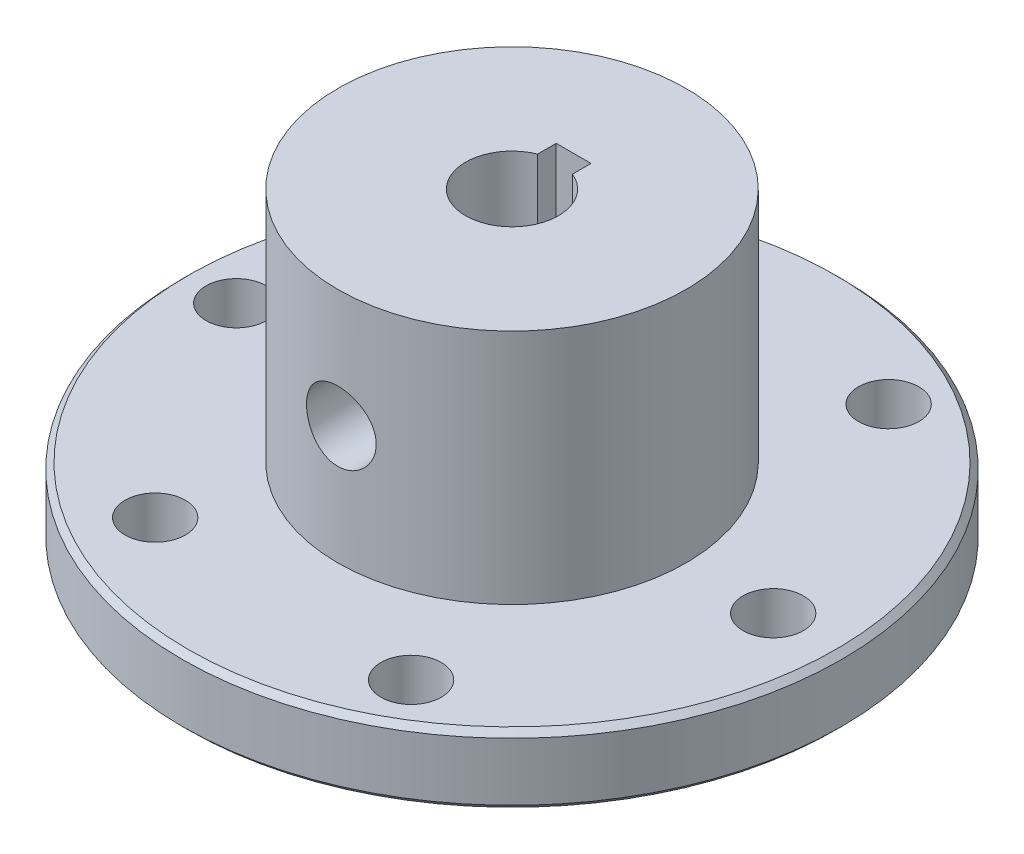
ISO-10303-21;
HEADER;
FILE_DESCRIPTION(('STEP AP214'),'2;1');
FILE_NAME('part.step','',(''),(''),'','','');
FILE_SCHEMA(('AUTOMOTIVE_DESIGN { 1 0 10303 214 1 1 1 1 }'));
ENDSEC;
DATA;
#1=APPLICATION_CONTEXT('core data for automotive mechanical design processes');
#2=APPLICATION_PROTOCOL_DEFINITION('international standard','automotive_design',2000,#1);
#3=PRODUCT_CONTEXT('',#1,'mechanical');
#4=PRODUCT('Part','Part','',(#3));
#5=PRODUCT_RELATED_PRODUCT_CATEGORY('part','',(#4));
#6=PRODUCT_DEFINITION_FORMATION('','',#4);
#7=PRODUCT_DEFINITION_CONTEXT('part definition',#1,'design');
#8=PRODUCT_DEFINITION('design','',#6,#7);
#9=PRODUCT_DEFINITION_SHAPE('','',#8);
#10=(LENGTH_UNIT() NAMED_UNIT(*) SI_UNIT(.MILLI.,.METRE.));
#11=(NAMED_UNIT(*) PLANE_ANGLE_UNIT() SI_UNIT($,.RADIAN.));
#12=(NAMED_UNIT(*) SI_UNIT($,.STERADIAN.) SOLID_ANGLE_UNIT());
#13=UNCERTAINTY_MEASURE_WITH_UNIT(LENGTH_MEASURE(1.E-05),#10,'distance_accuracy_value','');
#14=(GEOMETRIC_REPRESENTATION_CONTEXT(3) GLOBAL_UNCERTAINTY_ASSIGNED_CONTEXT((#13)) GLOBAL_UNIT_ASSIGNED_CONTEXT((#10,
#11,#12)) REPRESENTATION_CONTEXT('',''));
#15=CARTESIAN_POINT('',(0.,0.,0.));
#16=DIRECTION('',(0.,0.,1.));
#17=DIRECTION('',(1.,0.,0.));
#18=AXIS2_PLACEMENT_3D('',#15,#16,#17);
#19=CARTESIAN_POINT('',(0.,37.7137084989848,0.));
#20=DIRECTION('',(0.,-1.,0.));
#21=DIRECTION('',(0.,0.,-1.));
#22=AXIS2_PLACEMENT_3D('',#19,#20,#21);
#23=CYLINDRICAL_SURFACE('',#22,4.);
#24=CARTESIAN_POINT('',(0.,0.,0.));
#25=DIRECTION('',(0.,1.,0.));
#26=DIRECTION('',(0.,0.,1.));
#27=AXIS2_PLACEMENT_3D('',#24,#25,#26);
#28=CIRCLE('',#27,4.);
#29=CARTESIAN_POINT('',(-1.49999999999657,0.,-3.70809924354644));
#30=VERTEX_POINT('',#29);
#31=CARTESIAN_POINT('',(1.50000000000343,0.,-3.70809924354644));
#32=VERTEX_POINT('',#31);
#33=EDGE_CURVE('E157',#30,#32,#28,.T.);
#34=ORIENTED_EDGE('',*,*,#33,.F.);
#35=DIRECTION('',(0.,1.,0.));
#36=VECTOR('',#35,1.);
#37=CARTESIAN_POINT('',(-1.49999999999657,-3.4,-3.70809924354644));
#38=LINE('',#37,#36);
#39=CARTESIAN_POINT('',(-1.49999999999657,26.4,-3.70809924354644));
#40=VERTEX_POINT('',#39);
#41=EDGE_CURVE('E116',#30,#40,#38,.T.);
#42=ORIENTED_EDGE('',*,*,#41,.T.);
#43=CARTESIAN_POINT('',(0.,26.4,0.));
#44=DIRECTION('',(0.,1.,0.));
#45=DIRECTION('',(0.,0.,1.));
#46=AXIS2_PLACEMENT_3D('',#43,#44,#45);
#47=CIRCLE('',#46,4.);
#48=CARTESIAN_POINT('',(1.50000000000343,26.4,-3.70809924354644));
#49=VERTEX_POINT('',#48);
#50=EDGE_CURVE('E160',#40,#49,#47,.T.);
#51=ORIENTED_EDGE('',*,*,#50,.T.);
#52=DIRECTION('',(0.,1.,0.));
#53=VECTOR('',#52,1.);
#54=CARTESIAN_POINT('',(1.50000000000343,-3.4,-3.70809924354644));
#55=LINE('',#54,#53);
#56=EDGE_CURVE('E93',#32,#49,#55,.T.);
#57=ORIENTED_EDGE('',*,*,#56,.F.);
#58=EDGE_LOOP('',(#34,#42,#51,#57));
#59=FACE_BOUND('',#58,.T.);
#60=CARTESIAN_POINT('',(-3.,16.2,2.64575131106459));
#61=CARTESIAN_POINT('',(-3.00000280896557,16.1299599890454,2.645745510217));
#62=CARTESIAN_POINT('',(-2.99754094962657,16.0599423684369,2.64854755685349));
#63=CARTESIAN_POINT('',(-2.98778335234161,15.9206616329603,2.65954937326353));
#64=CARTESIAN_POINT('',(-2.98048600162194,15.8513987776647,2.6677509439258));
#65=CARTESIAN_POINT('',(-2.95155901854998,15.6454873787393,2.69984445943127));
#66=CARTESIAN_POINT('',(-2.92289529116371,15.5109260545199,2.73122303815329));
#67=CARTESIAN_POINT('',(-2.84967902852603,15.2528018992776,2.80749414131084));
#68=CARTESIAN_POINT('',(-2.80535116546462,15.1291129376528,2.85219424245675));
#69=CARTESIAN_POINT('',(-2.70261160960258,14.8913185987831,2.94973182273596));
#70=CARTESIAN_POINT('',(-2.64420161900243,14.7772120654922,3.0025683180905));
#71=CARTESIAN_POINT('',(-2.50080271595863,14.5357748543409,3.12354326851478));
#72=CARTESIAN_POINT('',(-2.41280926238807,14.4106800141176,3.19256884637289));
#73=CARTESIAN_POINT('',(-2.2186541254275,14.1749331613865,3.33043252944682));
#74=CARTESIAN_POINT('',(-2.11246568694302,14.0643028469581,3.3992702047211));
#75=CARTESIAN_POINT('',(-1.92836490190185,13.8999968907141,3.50539769561967));
#76=CARTESIAN_POINT('',(-1.85597029075026,13.8411504858405,3.54435965000119));
#77=CARTESIAN_POINT('',(-1.70504181430758,13.7298545058005,3.6193818859952));
#78=CARTESIAN_POINT('',(-1.62651080993559,13.6774019785274,3.6554435040806));
#79=CARTESIAN_POINT('',(-1.4637040910827,13.5795860727125,3.72361957309374));
#80=CARTESIAN_POINT('',(-1.37943756818547,13.5342117179806,3.75574011862965));
#81=CARTESIAN_POINT('',(-1.20559494807533,13.4512147175475,3.81509912700353));
#82=CARTESIAN_POINT('',(-1.11602169211668,13.4135879711787,3.84234017147395));
#83=CARTESIAN_POINT('',(-0.895799479373831,13.333620890258,3.90065407398259));
#84=CARTESIAN_POINT('',(-0.762908554560555,13.2952955212933,3.92898588633407));
#85=CARTESIAN_POINT('',(-0.491088777779701,13.2372100632104,3.97212104358515));
#86=CARTESIAN_POINT('',(-0.352165281713016,13.2174338444641,3.98693614179333));
#87=CARTESIAN_POINT('',(-0.0717346069513471,13.1975591423444,4.00182527262811));
#88=CARTESIAN_POINT('',(0.0697783346711295,13.197511789889,4.00186100185061));
#89=CARTESIAN_POINT('',(0.350633497188302,13.2172351747569,3.9870847294994));
#90=CARTESIAN_POINT('',(0.48997520779821,13.2370105015565,3.97226928948599));
#91=CARTESIAN_POINT('',(0.757778086122689,13.2941622791287,3.92982740624245));
#92=CARTESIAN_POINT('',(0.886448455408851,13.3309127006248,3.90265711426681));
#93=CARTESIAN_POINT('',(1.13536105117421,13.4199912365033,3.83764561419608));
#94=CARTESIAN_POINT('',(1.25560143283417,13.4723227475875,3.79980207941239));
#95=CARTESIAN_POINT('',(1.49843381849742,13.5970592451846,3.7112209069133));
#96=CARTESIAN_POINT('',(1.61987076262547,13.6710241972518,3.65953080871578));
#97=CARTESIAN_POINT('',(1.84913450790411,13.8334674039233,3.54921405312389));
#98=CARTESIAN_POINT('',(1.95694957120902,13.9219580262415,3.49058149661275));
#99=CARTESIAN_POINT('',(2.17816408331312,14.130446699028,3.35787531624607));
#100=CARTESIAN_POINT('',(2.28848985950527,14.2532184203887,3.28303311698989));
#101=CARTESIAN_POINT('',(2.48801751171524,14.5156691669079,3.13451916601303));
#102=CARTESIAN_POINT('',(2.57720932423716,14.6553561990931,3.06084798741906));
#103=CARTESIAN_POINT('',(2.71746412822589,14.9219637404567,2.93638851986388));
#104=CARTESIAN_POINT('',(2.77257733772077,15.0459740902602,2.88395199558713));
#105=CARTESIAN_POINT('',(2.86638794181777,15.3041305631791,2.79073482535992));
#106=CARTESIAN_POINT('',(2.90512243472909,15.4382529607061,2.74992790713867));
#107=CARTESIAN_POINT('',(2.95804770816485,15.687373886934,2.69280101182057));
#108=CARTESIAN_POINT('',(2.97558139385094,15.800894160623,2.67323078916896));
#109=CARTESIAN_POINT('',(2.9974352084815,16.0307109359537,2.6487117707326));
#110=CARTESIAN_POINT('',(3.00177224296671,16.1470036931607,2.64374426844221));
#111=CARTESIAN_POINT('',(2.99690541681498,16.3789579701068,2.64925736853119));
#112=CARTESIAN_POINT('',(2.98769657209908,16.4946192417781,2.6597436569903));
#113=CARTESIAN_POINT('',(2.95645049123765,16.7221523548121,2.6944244027003));
#114=CARTESIAN_POINT('',(2.93439135868922,16.8340173823666,2.71864225613374));
#115=CARTESIAN_POINT('',(2.86827946945848,17.0926758336122,2.78855502614561));
#116=CARTESIAN_POINT('',(2.81908501412404,17.2368707852246,2.83889586236445));
#117=CARTESIAN_POINT('',(2.70177633577471,17.5126164519626,2.95075783431284));
#118=CARTESIAN_POINT('',(2.6336272774567,17.6441432802658,3.01229948253766));
#119=CARTESIAN_POINT('',(2.47740025533047,17.8986936195923,3.14216325235084));
#120=CARTESIAN_POINT('',(2.38870032302785,18.0212490600596,3.21064858311595));
#121=CARTESIAN_POINT('',(2.19363312764519,18.2520208932289,3.34695922368101));
#122=CARTESIAN_POINT('',(2.08725728128944,18.360230273483,3.41478419579482));
#123=CARTESIAN_POINT('',(1.90239818691816,18.5215321316569,3.51957077757727));
#124=CARTESIAN_POINT('',(1.82922305126,18.5796581195259,3.55825033527664));
#125=CARTESIAN_POINT('',(1.67675777822379,18.6894381443225,3.63258399954073));
#126=CARTESIAN_POINT('',(1.59747053828962,18.7410952177284,3.66823952301724));
#127=CARTESIAN_POINT('',(1.43317795543372,18.8372413626488,3.73548722322447));
#128=CARTESIAN_POINT('',(1.34818053963823,18.8817400916681,3.7670848627361));
#129=CARTESIAN_POINT('',(1.1729453282209,18.962883343752,3.82527474095149));
#130=CARTESIAN_POINT('',(1.08271039442742,18.9995321057078,3.85186968010571));
#131=CARTESIAN_POINT('',(0.861573588365216,19.0768394641138,3.90835673615322));
#132=CARTESIAN_POINT('',(0.728516792900315,19.1135038047252,3.93550115203699));
#133=CARTESIAN_POINT('',(0.456712266621236,19.1682673656796,3.97621371280714));
#134=CARTESIAN_POINT('',(0.317969739628331,19.1863831844557,3.98979399550191));
#135=CARTESIAN_POINT('',(0.0382996918456589,19.2030301543583,4.0022690757003));
#136=CARTESIAN_POINT('',(-0.102632185789808,19.2015153312943,4.00112939966075));
#137=CARTESIAN_POINT('',(-0.382019221764016,19.1788787209871,3.9841766697547));
#138=CARTESIAN_POINT('',(-0.520473710285121,19.1577517104191,3.96835970687872));
#139=CARTESIAN_POINT('',(-0.787043562612911,19.0980499872263,3.92406786315679));
#140=CARTESIAN_POINT('',(-0.915342390371097,19.0599995894081,3.89597377375742));
#141=CARTESIAN_POINT('',(-1.16332276886422,18.9684239167212,3.82925445361189));
#142=CARTESIAN_POINT('',(-1.28300246946202,18.9148953316785,3.7906269702888));
#143=CARTESIAN_POINT('',(-1.52509537227953,18.7874441121832,3.70035282969446));
#144=CARTESIAN_POINT('',(-1.64628246914876,18.711898143361,3.64772704497865));
#145=CARTESIAN_POINT('',(-1.87482962773042,18.5462671128058,3.53571013069579));
#146=CARTESIAN_POINT('',(-1.98217681660194,18.4561686884255,3.47631279811073));
#147=CARTESIAN_POINT('',(-2.20224762299358,18.2439893112008,3.34212703425337));
#148=CARTESIAN_POINT('',(-2.31183387997297,18.1191073872141,3.26661834639248));
#149=CARTESIAN_POINT('',(-2.50950501943595,17.8522636700383,3.11732175300605));
#150=CARTESIAN_POINT('',(-2.59758202428157,17.7102956474977,3.04353448686308));
#151=CARTESIAN_POINT('',(-2.73391957253569,17.4422340480079,2.9209917244315));
#152=CARTESIAN_POINT('',(-2.78667101930055,17.3193318797256,2.87027147723429));
#153=CARTESIAN_POINT('',(-2.87610746935093,17.0638323336928,2.78065231320265));
#154=CARTESIAN_POINT('',(-2.91283513703737,16.931261812137,2.74172209031511));
#155=CARTESIAN_POINT('',(-2.95994243938014,16.6984283715323,2.69064580071015));
#156=CARTESIAN_POINT('',(-2.97488911938737,16.6000813613047,2.67399401036028));
#157=CARTESIAN_POINT('',(-2.99491264524007,16.4011398406143,2.65155449367015));
#158=CARTESIAN_POINT('',(-2.99999596755293,16.3005468488339,2.6457596385468));
#159=CARTESIAN_POINT('',(-3.,16.2,2.64575131106459));
#160=B_SPLINE_CURVE_WITH_KNOTS('',3,(#60,#61,#62,#63,#64,#65,#66,#67,#68,#69,#70,#71,#72,#73,
#74,#75,#76,#77,#78,#79,#80,#81,#82,#83,#84,#85,#86,#87,#88,#89,#90,#91,#92,#93,#94,#95,#96,#97,
#98,#99,#100,#101,#102,#103,#104,#105,#106,#107,#108,#109,#110,#111,#112,#113,#114,#115,#116,
#117,#118,#119,#120,#121,#122,#123,#124,#125,#126,#127,#128,#129,#130,#131,#132,#133,#134,#135,
#136,#137,#138,#139,#140,#141,#142,#143,#144,#145,#146,#147,#148,#149,#150,#151,#152,#153,#154,
#155,#156,#157,#158,#159),.UNSPECIFIED.,.T.,.F.,(4,2,2,2,2,2,2,2,2,2,2,2,2,2,2,2,2,2,2,2,2,2,2,
2,2,2,2,2,2,2,2,2,2,2,2,2,2,2,2,2,2,2,2,2,2,2,2,2,2,4),(0.,0.209978661686241,0.420027392494301,
0.840743284291307,1.2556546103656,1.67051580847,2.17226801294869,2.6747644597623,
2.97770625271005,3.2805076408197,3.58283470135666,3.88500133203434,4.30659768868618,
4.7278271005493,5.15014819769121,5.57256709596084,5.98051830103608,6.38855850530846,
6.84078006547297,7.29338868088834,7.83503352722911,8.37693577609373,8.81203137267901,
9.24613611539519,9.5942032940531,9.94182439389893,10.2895734296593,10.6379167570555,
11.116643747183,11.5962564359181,12.0929073649363,12.5898001720674,12.8928465253493,
13.1957500925973,13.4982415141315,13.8005691796993,14.2206053318566,14.6402652787516,
15.0609082299889,15.4816632434469,15.8902036618063,16.2988315155547,16.7537484577602,
17.2090855228609,17.7544990195311,18.3001119721386,18.7279130007847,19.154567923422,
19.4562036495329,19.7576412488016),.UNSPECIFIED.);
#161=CARTESIAN_POINT('',(-3.,16.2,2.64575131106459));
#162=VERTEX_POINT('',#161);
#163=EDGE_CURVE('E108',#162,#162,#160,.T.);
#164=ORIENTED_EDGE('',*,*,#163,.T.);
#165=EDGE_LOOP('',(#164));
#166=FACE_BOUND('',#165,.T.);
#167=ADVANCED_FACE('F43',(#59,#166),#23,.F.);
#168=CARTESIAN_POINT('',(0.,26.4,0.));
#169=DIRECTION('',(0.,1.,0.));
#170=DIRECTION('',(0.,0.,1.));
#171=AXIS2_PLACEMENT_3D('',#168,#169,#170);
#172=PLANE('',#171);
#173=ORIENTED_EDGE('',*,*,#50,.F.);
#174=DIRECTION('',(0.,0.,-1.));
#175=VECTOR('',#174,1.);
#176=CARTESIAN_POINT('',(-1.49999999999657,26.4,0.));
#177=LINE('',#176,#175);
#178=CARTESIAN_POINT('',(-1.49999999999657,26.4,-5.30809924354644));
#179=VERTEX_POINT('',#178);
#180=EDGE_CURVE('E101',#40,#179,#177,.T.);
#181=ORIENTED_EDGE('',*,*,#180,.T.);
#182=DIRECTION('',(1.,0.,0.));
#183=VECTOR('',#182,1.);
#184=CARTESIAN_POINT('',(0.,26.4,-5.30809924354644));
#185=LINE('',#184,#183);
#186=CARTESIAN_POINT('',(1.50000000000343,26.4,-5.30809924354644));
#187=VERTEX_POINT('',#186);
#188=EDGE_CURVE('E89',#179,#187,#185,.T.);
#189=ORIENTED_EDGE('',*,*,#188,.T.);
#190=DIRECTION('',(0.,0.,1.));
#191=VECTOR('',#190,1.);
#192=CARTESIAN_POINT('',(1.50000000000343,26.4,0.));
#193=LINE('',#192,#191);
#194=EDGE_CURVE('E96',#187,#49,#193,.T.);
#195=ORIENTED_EDGE('',*,*,#194,.T.);
#196=EDGE_LOOP('',(#173,#181,#189,#195));
#197=FACE_BOUND('',#196,.T.);
#198=CARTESIAN_POINT('',(0.,26.4,0.));
#199=DIRECTION('',(0.,1.,0.));
#200=DIRECTION('',(0.,0.,1.));
#201=AXIS2_PLACEMENT_3D('',#198,#199,#200);
#202=CIRCLE('',#201,15.);
#203=CARTESIAN_POINT('',(0.,26.4,15.));
#204=VERTEX_POINT('',#203);
#205=EDGE_CURVE('E162',#204,#204,#202,.T.);
#206=ORIENTED_EDGE('',*,*,#205,.T.);
#207=EDGE_LOOP('',(#206));
#208=FACE_BOUND('',#207,.T.);
#209=ADVANCED_FACE('F103',(#197,#208),#172,.T.);
#210=CARTESIAN_POINT('',(0.,26.4,0.));
#211=DIRECTION('',(0.,-1.,0.));
#212=DIRECTION('',(0.,0.,-1.));
#213=AXIS2_PLACEMENT_3D('',#210,#211,#212);
#214=CYLINDRICAL_SURFACE('',#213,15.);
#215=CARTESIAN_POINT('',(-3.,16.2,14.6969384566991));
#216=CARTESIAN_POINT('',(-2.99999198480185,16.3665193361401,14.6969426132629));
#217=CARTESIAN_POINT('',(-2.98607569250481,16.5332456360587,14.6998020102084));
#218=CARTESIAN_POINT('',(-2.93078641718596,16.8621151386166,14.7109229493115));
#219=CARTESIAN_POINT('',(-2.88935895976318,17.0242485815656,14.7191952089108));
#220=CARTESIAN_POINT('',(-2.78037980337341,17.3389280436671,14.7401676901752));
#221=CARTESIAN_POINT('',(-2.71286603599808,17.49148761131,14.7528614799519));
#222=CARTESIAN_POINT('',(-2.55372247754635,17.7830637317369,14.781238226133));
#223=CARTESIAN_POINT('',(-2.46210056979045,17.9220846912995,14.7969202049432));
#224=CARTESIAN_POINT('',(-2.25593999242807,18.184679081421,14.8297585534668));
#225=CARTESIAN_POINT('',(-2.14112308660168,18.3080320867916,14.8469312215107));
#226=CARTESIAN_POINT('',(-1.89242749025971,18.5338672529959,14.880673286009));
#227=CARTESIAN_POINT('',(-1.75854645433866,18.6363468420571,14.8972426079201));
#228=CARTESIAN_POINT('',(-1.47408345798555,18.8183644149512,14.9280839590212));
#229=CARTESIAN_POINT('',(-1.32336642386834,18.8976952065151,14.9423347639853));
#230=CARTESIAN_POINT('',(-1.01041107789758,19.0298252659684,14.9667521927314));
#231=CARTESIAN_POINT('',(-0.848173943656585,19.0826272412542,14.9769192332603));
#232=CARTESIAN_POINT('',(-0.51905044746347,19.1595215491989,14.9919096148132));
#233=CARTESIAN_POINT('',(-0.352253477172984,19.1839828951711,14.9968015811167));
#234=CARTESIAN_POINT('',(-0.0168559667308238,19.2046528609467,15.0009276366248));
#235=CARTESIAN_POINT('',(0.151744400903096,19.2008641595094,15.0001622622766));
#236=CARTESIAN_POINT('',(0.483425380483719,19.1654215289158,14.993113059308));
#237=CARTESIAN_POINT('',(0.646550409160077,19.1341653165699,14.986907997931));
#238=CARTESIAN_POINT('',(0.965193700988312,19.0453053273351,14.9697653976188));
#239=CARTESIAN_POINT('',(1.12071160201188,18.9877002974905,14.9588276336324));
#240=CARTESIAN_POINT('',(1.42086391732483,18.8474073381281,14.9333184098713));
#241=CARTESIAN_POINT('',(1.56542314271073,18.7645628188652,14.9187243693907));
#242=CARTESIAN_POINT('',(1.83872463786869,18.5762648332999,14.8875128621812));
#243=CARTESIAN_POINT('',(1.96746624716601,18.4708104234113,14.8708953110171));
#244=CARTESIAN_POINT('',(2.2078284591651,18.2381247436597,14.8371325493209));
#245=CARTESIAN_POINT('',(2.31911539479422,18.1105491845465,14.8199831814693));
#246=CARTESIAN_POINT('',(2.51881788912917,17.838310003786,14.7873537736521));
#247=CARTESIAN_POINT('',(2.60722327377097,17.6936388222328,14.771874478046));
#248=CARTESIAN_POINT('',(2.75876346440551,17.3907953198127,14.7443276238647));
#249=CARTESIAN_POINT('',(2.82182361241791,17.2325847531412,14.7322701750419));
#250=CARTESIAN_POINT('',(2.92024407190785,16.9077195482061,14.7130801968736));
#251=CARTESIAN_POINT('',(2.95566278798359,16.7410835105951,14.7059372872213));
#252=CARTESIAN_POINT('',(2.98449164007207,16.5109815416052,14.7000967999871));
#253=CARTESIAN_POINT('',(2.99030226562781,16.4489419267923,14.6989152123563));
#254=CARTESIAN_POINT('',(2.99805794883958,16.3246112043473,14.6973352622238));
#255=CARTESIAN_POINT('',(3.00000299969921,16.2623200962731,14.6969369010992));
#256=CARTESIAN_POINT('',(2.99999198480185,16.0334806638599,14.6969426132629));
#257=CARTESIAN_POINT('',(2.98607569250482,15.8667543639413,14.6998020102084));
#258=CARTESIAN_POINT('',(2.93078641718597,15.5378848613834,14.7109229493115));
#259=CARTESIAN_POINT('',(2.88935895976318,15.3757514184344,14.7191952089108));
#260=CARTESIAN_POINT('',(2.78037980337341,15.0610719563329,14.7401676901752));
#261=CARTESIAN_POINT('',(2.71286603599809,14.90851238869,14.7528614799519));
#262=CARTESIAN_POINT('',(2.55372247754635,14.6169362682631,14.781238226133));
#263=CARTESIAN_POINT('',(2.46210056979046,14.4779153087005,14.7969202049432));
#264=CARTESIAN_POINT('',(2.25593999242808,14.215320918579,14.8297585534668));
#265=CARTESIAN_POINT('',(2.14112308660168,14.0919679132084,14.8469312215107));
#266=CARTESIAN_POINT('',(1.89242749025971,13.8661327470041,14.880673286009));
#267=CARTESIAN_POINT('',(1.75854645433867,13.7636531579429,14.8972426079201));
#268=CARTESIAN_POINT('',(1.47408345798556,13.5816355850488,14.9280839590212));
#269=CARTESIAN_POINT('',(1.32336642386834,13.5023047934849,14.9423347639853));
#270=CARTESIAN_POINT('',(1.01041107789758,13.3701747340316,14.9667521927314));
#271=CARTESIAN_POINT('',(0.848173943656591,13.3173727587458,14.9769192332603));
#272=CARTESIAN_POINT('',(0.519050447463476,13.2404784508011,14.9919096148132));
#273=CARTESIAN_POINT('',(0.35225347717299,13.2160171048289,14.9968015811167));
#274=CARTESIAN_POINT('',(0.0168559667308302,13.1953471390533,15.0009276366248));
#275=CARTESIAN_POINT('',(-0.151744400903089,13.1991358404906,15.0001622622766));
#276=CARTESIAN_POINT('',(-0.483425380483713,13.2345784710842,14.993113059308));
#277=CARTESIAN_POINT('',(-0.646550409160072,13.2658346834301,14.986907997931));
#278=CARTESIAN_POINT('',(-0.965193700988306,13.3546946726649,14.9697653976188));
#279=CARTESIAN_POINT('',(-1.12071160201187,13.4122997025095,14.9588276336324));
#280=CARTESIAN_POINT('',(-1.42086391732483,13.5525926618719,14.9333184098713));
#281=CARTESIAN_POINT('',(-1.56542314271073,13.6354371811348,14.9187243693907));
#282=CARTESIAN_POINT('',(-1.83872463786868,13.8237351667001,14.8875128621812));
#283=CARTESIAN_POINT('',(-1.96746624716601,13.9291895765887,14.8708953110171));
#284=CARTESIAN_POINT('',(-2.20782845916509,14.1618752563403,14.8371325493209));
#285=CARTESIAN_POINT('',(-2.31911539479422,14.2894508154535,14.8199831814693));
#286=CARTESIAN_POINT('',(-2.51881788912917,14.561689996214,14.7873537736521));
#287=CARTESIAN_POINT('',(-2.60722327377097,14.7063611777672,14.771874478046));
#288=CARTESIAN_POINT('',(-2.7587634644055,15.0092046801873,14.7443276238647));
#289=CARTESIAN_POINT('',(-2.82182361241791,15.1674152468588,14.7322701750419));
#290=CARTESIAN_POINT('',(-2.92024407190784,15.4922804517939,14.7130801968736));
#291=CARTESIAN_POINT('',(-2.95566278798359,15.6589164894049,14.7059372872213));
#292=CARTESIAN_POINT('',(-2.98449164007207,15.8890184583948,14.7000967999872));
#293=CARTESIAN_POINT('',(-2.9903022656278,15.9510580732077,14.6989152123563));
#294=CARTESIAN_POINT('',(-2.99805794883957,16.0753887956527,14.6973352622238));
#295=CARTESIAN_POINT('',(-3.0000029996992,16.1376799037269,14.6969369010992));
#296=CARTESIAN_POINT('',(-3.,16.2,14.6969384566991));
#297=B_SPLINE_CURVE_WITH_KNOTS('',3,(#215,#216,#217,#218,#219,#220,#221,#222,#223,#224,#225,
#226,#227,#228,#229,#230,#231,#232,#233,#234,#235,#236,#237,#238,#239,#240,#241,#242,#243,#244,
#245,#246,#247,#248,#249,#250,#251,#252,#253,#254,#255,#256,#257,#258,#259,#260,#261,#262,#263,
#264,#265,#266,#267,#268,#269,#270,#271,#272,#273,#274,#275,#276,#277,#278,#279,#280,#281,#282,
#283,#284,#285,#286,#287,#288,#289,#290,#291,#292,#293,#294,#295,#296),.UNSPECIFIED.,.T.,.F.,(4,
2,2,2,2,2,2,2,2,2,2,2,2,2,2,2,2,2,2,2,2,2,2,2,2,2,2,2,2,2,2,2,2,2,2,2,2,2,2,2,4),(0.,
0.499319534883171,0.999630723861625,1.49921714142011,1.99864039765989,2.50445415949448,
3.01033020400208,3.52060417049913,4.03082605043846,4.53432707996163,5.03778036652496,
5.53406181995143,6.03036687532318,6.52981605162436,7.02928607566478,7.53737244483725,
8.04568434317572,8.5554827615847,9.06420106962761,9.25107178083575,9.43794282059773,
9.9372623554809,10.4375735444593,10.9371599620178,11.4365832182576,11.9423969800922,
12.4482730245998,12.9585469910969,13.4687688710362,13.9722699005594,14.4757231871227,
14.9720046405492,15.4683096959209,15.9677588722221,16.4672288962625,16.975315265435,
17.4836271637734,17.9934255821824,18.5021438902253,18.6890146014335,18.8758856411955),.UNSPECIFIED.);
#298=CARTESIAN_POINT('',(-3.,16.2,14.6969384566991));
#299=VERTEX_POINT('',#298);
#300=EDGE_CURVE('E105',#299,#299,#297,.T.);
#301=ORIENTED_EDGE('',*,*,#300,.T.);
#302=EDGE_LOOP('',(#301));
#303=FACE_BOUND('',#302,.T.);
#304=CARTESIAN_POINT('',(0.,6.,0.));
#305=DIRECTION('',(0.,1.,0.));
#306=DIRECTION('',(0.,0.,1.));
#307=AXIS2_PLACEMENT_3D('',#304,#305,#306);
#308=CIRCLE('',#307,15.);
#309=CARTESIAN_POINT('',(0.,6.,15.));
#310=VERTEX_POINT('',#309);
#311=EDGE_CURVE('E165',#310,#310,#308,.T.);
#312=ORIENTED_EDGE('',*,*,#311,.T.);
#313=EDGE_LOOP('',(#312));
#314=FACE_BOUND('',#313,.T.);
#315=ORIENTED_EDGE('',*,*,#205,.F.);
#316=EDGE_LOOP('',(#315));
#317=FACE_BOUND('',#316,.T.);
#318=ADVANCED_FACE('F204',(#303,#314,#317),#214,.T.);
#319=CARTESIAN_POINT('',(0.,0.,0.));
#320=DIRECTION('',(0.,1.,0.));
#321=DIRECTION('',(0.,0.,1.));
#322=AXIS2_PLACEMENT_3D('',#319,#320,#321);
#323=PLANE('',#322);
#324=CARTESIAN_POINT('',(0.,0.,0.));
#325=DIRECTION('',(0.,1.,0.));
#326=DIRECTION('',(0.,0.,1.));
#327=AXIS2_PLACEMENT_3D('',#324,#325,#326);
#328=CIRCLE('',#327,27.9);
#329=CARTESIAN_POINT('',(0.,0.,27.9));
#330=VERTEX_POINT('',#329);
#331=EDGE_CURVE('E11',#330,#330,#328,.F.);
#332=ORIENTED_EDGE('',*,*,#331,.T.);
#333=EDGE_LOOP('',(#332));
#334=FACE_BOUND('',#333,.T.);
#335=CARTESIAN_POINT('',(11.875,0.,-20.5681033398804));
#336=DIRECTION('',(0.,1.,0.));
#337=DIRECTION('',(0.,0.,1.));
#338=AXIS2_PLACEMENT_3D('',#335,#336,#337);
#339=CIRCLE('',#338,2.6);
#340=CARTESIAN_POINT('',(11.875,0.,-17.9681033398804));
#341=VERTEX_POINT('',#340);
#342=EDGE_CURVE('E154',#341,#341,#339,.F.);
#343=ORIENTED_EDGE('',*,*,#342,.F.);
#344=EDGE_LOOP('',(#343));
#345=FACE_BOUND('',#344,.T.);
#346=CARTESIAN_POINT('',(22.5,0.,0.));
#347=DIRECTION('',(0.,1.,0.));
#348=DIRECTION('',(0.,0.,1.));
#349=AXIS2_PLACEMENT_3D('',#346,#347,#348);
#350=CIRCLE('',#349,2.6);
#351=CARTESIAN_POINT('',(22.5,0.,2.6));
#352=VERTEX_POINT('',#351);
#353=EDGE_CURVE('E124',#352,#352,#350,.F.);
#354=ORIENTED_EDGE('',*,*,#353,.F.);
#355=EDGE_LOOP('',(#354));
#356=FACE_BOUND('',#355,.T.);
#357=CARTESIAN_POINT('',(11.875,0.,20.5681033398804));
#358=DIRECTION('',(0.,1.,0.));
#359=DIRECTION('',(0.,0.,1.));
#360=AXIS2_PLACEMENT_3D('',#357,#358,#359);
#361=CIRCLE('',#360,2.6);
#362=CARTESIAN_POINT('',(11.875,0.,23.1681033398804));
#363=VERTEX_POINT('',#362);
#364=EDGE_CURVE('E125',#363,#363,#361,.F.);
#365=ORIENTED_EDGE('',*,*,#364,.F.);
#366=EDGE_LOOP('',(#365));
#367=FACE_BOUND('',#366,.T.);
#368=CARTESIAN_POINT('',(-11.25,0.,19.4855715851499));
#369=DIRECTION('',(0.,1.,0.));
#370=DIRECTION('',(0.,0.,1.));
#371=AXIS2_PLACEMENT_3D('',#368,#369,#370);
#372=CIRCLE('',#371,2.6);
#373=CARTESIAN_POINT('',(-11.25,0.,22.0855715851499));
#374=VERTEX_POINT('',#373);
#375=EDGE_CURVE('E132',#374,#374,#372,.F.);
#376=ORIENTED_EDGE('',*,*,#375,.F.);
#377=EDGE_LOOP('',(#376));
#378=FACE_BOUND('',#377,.T.);
#379=CARTESIAN_POINT('',(-23.75,0.,0.));
#380=DIRECTION('',(0.,1.,0.));
#381=DIRECTION('',(0.,0.,1.));
#382=AXIS2_PLACEMENT_3D('',#379,#380,#381);
#383=CIRCLE('',#382,2.6);
#384=CARTESIAN_POINT('',(-23.75,0.,2.6));
#385=VERTEX_POINT('',#384);
#386=EDGE_CURVE('E138',#385,#385,#383,.F.);
#387=ORIENTED_EDGE('',*,*,#386,.F.);
#388=EDGE_LOOP('',(#387));
#389=FACE_BOUND('',#388,.T.);
#390=CARTESIAN_POINT('',(-11.25,0.,-19.4855715851499));
#391=DIRECTION('',(0.,1.,0.));
#392=DIRECTION('',(0.,0.,1.));
#393=AXIS2_PLACEMENT_3D('',#390,#391,#392);
#394=CIRCLE('',#393,2.6);
#395=CARTESIAN_POINT('',(-11.25,0.,-16.8855715851499));
#396=VERTEX_POINT('',#395);
#397=EDGE_CURVE('E144',#396,#396,#394,.F.);
#398=ORIENTED_EDGE('',*,*,#397,.F.);
#399=EDGE_LOOP('',(#398));
#400=FACE_BOUND('',#399,.T.);
#401=DIRECTION('',(0.,0.,1.));
#402=VECTOR('',#401,1.);
#403=CARTESIAN_POINT('',(-1.49999999999657,0.,0.));
#404=LINE('',#403,#402);
#405=CARTESIAN_POINT('',(-1.49999999999657,0.,-5.30809924354644));
#406=VERTEX_POINT('',#405);
#407=EDGE_CURVE('E67',#406,#30,#404,.T.);
#408=ORIENTED_EDGE('',*,*,#407,.T.);
#409=ORIENTED_EDGE('',*,*,#33,.T.);
#410=DIRECTION('',(0.,0.,-1.));
#411=VECTOR('',#410,1.);
#412=CARTESIAN_POINT('',(1.50000000000343,0.,0.));
#413=LINE('',#412,#411);
#414=CARTESIAN_POINT('',(1.50000000000343,0.,-5.30809924354644));
#415=VERTEX_POINT('',#414);
#416=EDGE_CURVE('E59',#32,#415,#413,.T.);
#417=ORIENTED_EDGE('',*,*,#416,.T.);
#418=DIRECTION('',(-1.,0.,0.));
#419=VECTOR('',#418,1.);
#420=CARTESIAN_POINT('',(0.,0.,-5.30809924354644));
#421=LINE('',#420,#419);
#422=EDGE_CURVE('E92',#415,#406,#421,.T.);
#423=ORIENTED_EDGE('',*,*,#422,.T.);
#424=EDGE_LOOP('',(#408,#409,#417,#423));
#425=FACE_BOUND('',#424,.T.);
#426=ADVANCED_FACE('F207',(#334,#345,#356,#367,#378,#389,#400,#425),#323,.F.);
#427=CARTESIAN_POINT('',(0.,6.,0.));
#428=DIRECTION('',(0.,-1.,0.));
#429=DIRECTION('',(0.,0.,-1.));
#430=AXIS2_PLACEMENT_3D('',#427,#428,#429);
#431=CYLINDRICAL_SURFACE('',#430,28.4);
#432=CARTESIAN_POINT('',(0.,5.5,0.));
#433=DIRECTION('',(0.,1.,0.));
#434=DIRECTION('',(0.,0.,1.));
#435=AXIS2_PLACEMENT_3D('',#432,#433,#434);
#436=CIRCLE('',#435,28.4);
#437=CARTESIAN_POINT('',(0.,5.5,28.4));
#438=VERTEX_POINT('',#437);
#439=EDGE_CURVE('E52',#438,#438,#436,.F.);
#440=ORIENTED_EDGE('',*,*,#439,.T.);
#441=EDGE_LOOP('',(#440));
#442=FACE_BOUND('',#441,.T.);
#443=CARTESIAN_POINT('',(0.,0.500000000000007,0.));
#444=DIRECTION('',(0.,1.,0.));
#445=DIRECTION('',(0.,0.,1.));
#446=AXIS2_PLACEMENT_3D('',#443,#444,#445);
#447=CIRCLE('',#446,28.4);
#448=CARTESIAN_POINT('',(0.,0.500000000000007,28.4));
#449=VERTEX_POINT('',#448);
#450=EDGE_CURVE('E171',#449,#449,#447,.T.);
#451=ORIENTED_EDGE('',*,*,#450,.T.);
#452=EDGE_LOOP('',(#451));
#453=FACE_BOUND('',#452,.T.);
#454=ADVANCED_FACE('F176',(#442,#453),#431,.T.);
#455=CARTESIAN_POINT('',(0.,6.,0.));
#456=DIRECTION('',(0.,1.,0.));
#457=DIRECTION('',(0.,0.,1.));
#458=AXIS2_PLACEMENT_3D('',#455,#456,#457);
#459=PLANE('',#458);
#460=CARTESIAN_POINT('',(0.,6.,0.));
#461=DIRECTION('',(0.,1.,0.));
#462=DIRECTION('',(0.,0.,1.));
#463=AXIS2_PLACEMENT_3D('',#460,#461,#462);
#464=CIRCLE('',#463,27.9);
#465=CARTESIAN_POINT('',(0.,6.,27.9));
#466=VERTEX_POINT('',#465);
#467=EDGE_CURVE('E168',#466,#466,#464,.T.);
#468=ORIENTED_EDGE('',*,*,#467,.T.);
#469=EDGE_LOOP('',(#468));
#470=FACE_BOUND('',#469,.T.);
#471=CARTESIAN_POINT('',(-11.25,6.,-19.4855715851499));
#472=DIRECTION('',(0.,1.,0.));
#473=DIRECTION('',(0.,0.,1.));
#474=AXIS2_PLACEMENT_3D('',#471,#472,#473);
#475=CIRCLE('',#474,2.6);
#476=CARTESIAN_POINT('',(-11.25,6.,-16.8855715851499));
#477=VERTEX_POINT('',#476);
#478=EDGE_CURVE('E147',#477,#477,#475,.T.);
#479=ORIENTED_EDGE('',*,*,#478,.F.);
#480=EDGE_LOOP('',(#479));
#481=FACE_BOUND('',#480,.T.);
#482=CARTESIAN_POINT('',(-23.75,6.,0.));
#483=DIRECTION('',(0.,1.,0.));
#484=DIRECTION('',(0.,0.,1.));
#485=AXIS2_PLACEMENT_3D('',#482,#483,#484);
#486=CIRCLE('',#485,2.6);
#487=CARTESIAN_POINT('',(-23.75,6.,2.6));
#488=VERTEX_POINT('',#487);
#489=EDGE_CURVE('E141',#488,#488,#486,.T.);
#490=ORIENTED_EDGE('',*,*,#489,.F.);
#491=EDGE_LOOP('',(#490));
#492=FACE_BOUND('',#491,.T.);
#493=CARTESIAN_POINT('',(-11.25,6.,19.4855715851499));
#494=DIRECTION('',(0.,1.,0.));
#495=DIRECTION('',(0.,0.,1.));
#496=AXIS2_PLACEMENT_3D('',#493,#494,#495);
#497=CIRCLE('',#496,2.6);
#498=CARTESIAN_POINT('',(-11.25,6.,22.0855715851499));
#499=VERTEX_POINT('',#498);
#500=EDGE_CURVE('E135',#499,#499,#497,.T.);
#501=ORIENTED_EDGE('',*,*,#500,.F.);
#502=EDGE_LOOP('',(#501));
#503=FACE_BOUND('',#502,.T.);
#504=CARTESIAN_POINT('',(11.875,6.,20.5681033398804));
#505=DIRECTION('',(0.,1.,0.));
#506=DIRECTION('',(0.,0.,1.));
#507=AXIS2_PLACEMENT_3D('',#504,#505,#506);
#508=CIRCLE('',#507,2.6);
#509=CARTESIAN_POINT('',(11.875,6.,23.1681033398804));
#510=VERTEX_POINT('',#509);
#511=EDGE_CURVE('E129',#510,#510,#508,.T.);
#512=ORIENTED_EDGE('',*,*,#511,.F.);
#513=EDGE_LOOP('',(#512));
#514=FACE_BOUND('',#513,.T.);
#515=CARTESIAN_POINT('',(22.5,6.,0.));
#516=DIRECTION('',(0.,1.,0.));
#517=DIRECTION('',(0.,0.,1.));
#518=AXIS2_PLACEMENT_3D('',#515,#516,#517);
#519=CIRCLE('',#518,2.6);
#520=CARTESIAN_POINT('',(22.5,6.,2.6));
#521=VERTEX_POINT('',#520);
#522=EDGE_CURVE('E121',#521,#521,#519,.T.);
#523=ORIENTED_EDGE('',*,*,#522,.F.);
#524=EDGE_LOOP('',(#523));
#525=FACE_BOUND('',#524,.T.);
#526=CARTESIAN_POINT('',(11.875,6.,-20.5681033398804));
#527=DIRECTION('',(0.,1.,0.));
#528=DIRECTION('',(0.,0.,1.));
#529=AXIS2_PLACEMENT_3D('',#526,#527,#528);
#530=CIRCLE('',#529,2.6);
#531=CARTESIAN_POINT('',(11.875,6.,-17.9681033398804));
#532=VERTEX_POINT('',#531);
#533=EDGE_CURVE('E128',#532,#532,#530,.T.);
#534=ORIENTED_EDGE('',*,*,#533,.F.);
#535=EDGE_LOOP('',(#534));
#536=FACE_BOUND('',#535,.T.);
#537=ORIENTED_EDGE('',*,*,#311,.F.);
#538=EDGE_LOOP('',(#537));
#539=FACE_BOUND('',#538,.T.);
#540=ADVANCED_FACE('F185',(#470,#481,#492,#503,#514,#525,#536,#539),#459,.T.);
#541=CARTESIAN_POINT('',(11.875,-7.3539105243401,-20.5681033398804));
#542=DIRECTION('',(0.,1.,0.));
#543=DIRECTION('',(0.,0.,1.));
#544=AXIS2_PLACEMENT_3D('',#541,#542,#543);
#545=CYLINDRICAL_SURFACE('',#544,2.6);
#546=ORIENTED_EDGE('',*,*,#342,.T.);
#547=EDGE_LOOP('',(#546));
#548=FACE_BOUND('',#547,.T.);
#549=ORIENTED_EDGE('',*,*,#533,.T.);
#550=EDGE_LOOP('',(#549));
#551=FACE_BOUND('',#550,.T.);
#552=ADVANCED_FACE('F188',(#548,#551),#545,.F.);
#553=CARTESIAN_POINT('',(22.5,-7.3539105243401,0.));
#554=DIRECTION('',(0.,1.,0.));
#555=DIRECTION('',(0.,0.,1.));
#556=AXIS2_PLACEMENT_3D('',#553,#554,#555);
#557=CYLINDRICAL_SURFACE('',#556,2.6);
#558=ORIENTED_EDGE('',*,*,#353,.T.);
#559=EDGE_LOOP('',(#558));
#560=FACE_BOUND('',#559,.T.);
#561=ORIENTED_EDGE('',*,*,#522,.T.);
#562=EDGE_LOOP('',(#561));
#563=FACE_BOUND('',#562,.T.);
#564=ADVANCED_FACE('F244',(#560,#563),#557,.F.);
#565=CARTESIAN_POINT('',(11.875,-7.3539105243401,20.5681033398804));
#566=DIRECTION('',(0.,1.,0.));
#567=DIRECTION('',(0.,0.,1.));
#568=AXIS2_PLACEMENT_3D('',#565,#566,#567);
#569=CYLINDRICAL_SURFACE('',#568,2.6);
#570=ORIENTED_EDGE('',*,*,#364,.T.);
#571=EDGE_LOOP('',(#570));
#572=FACE_BOUND('',#571,.T.);
#573=ORIENTED_EDGE('',*,*,#511,.T.);
#574=EDGE_LOOP('',(#573));
#575=FACE_BOUND('',#574,.T.);
#576=ADVANCED_FACE('F247',(#572,#575),#569,.F.);
#577=CARTESIAN_POINT('',(-11.25,-7.3539105243401,19.4855715851499));
#578=DIRECTION('',(0.,1.,0.));
#579=DIRECTION('',(0.,0.,1.));
#580=AXIS2_PLACEMENT_3D('',#577,#578,#579);
#581=CYLINDRICAL_SURFACE('',#580,2.6);
#582=ORIENTED_EDGE('',*,*,#375,.T.);
#583=EDGE_LOOP('',(#582));
#584=FACE_BOUND('',#583,.T.);
#585=ORIENTED_EDGE('',*,*,#500,.T.);
#586=EDGE_LOOP('',(#585));
#587=FACE_BOUND('',#586,.T.);
#588=ADVANCED_FACE('F251',(#584,#587),#581,.F.);
#589=CARTESIAN_POINT('',(-23.75,-7.3539105243401,0.));
#590=DIRECTION('',(0.,1.,0.));
#591=DIRECTION('',(0.,0.,1.));
#592=AXIS2_PLACEMENT_3D('',#589,#590,#591);
#593=CYLINDRICAL_SURFACE('',#592,2.6);
#594=ORIENTED_EDGE('',*,*,#386,.T.);
#595=EDGE_LOOP('',(#594));
#596=FACE_BOUND('',#595,.T.);
#597=ORIENTED_EDGE('',*,*,#489,.T.);
#598=EDGE_LOOP('',(#597));
#599=FACE_BOUND('',#598,.T.);
#600=ADVANCED_FACE('F255',(#596,#599),#593,.F.);
#601=CARTESIAN_POINT('',(-11.25,-7.3539105243401,-19.4855715851499));
#602=DIRECTION('',(0.,1.,0.));
#603=DIRECTION('',(0.,0.,1.));
#604=AXIS2_PLACEMENT_3D('',#601,#602,#603);
#605=CYLINDRICAL_SURFACE('',#604,2.6);
#606=ORIENTED_EDGE('',*,*,#397,.T.);
#607=EDGE_LOOP('',(#606));
#608=FACE_BOUND('',#607,.T.);
#609=ORIENTED_EDGE('',*,*,#478,.T.);
#610=EDGE_LOOP('',(#609));
#611=FACE_BOUND('',#610,.T.);
#612=ADVANCED_FACE('F239',(#608,#611),#605,.F.);
#613=CARTESIAN_POINT('',(-1.49999999999657,-3.4,0.));
#614=DIRECTION('',(1.,0.,0.));
#615=DIRECTION('',(0.,0.,-1.));
#616=AXIS2_PLACEMENT_3D('',#613,#614,#615);
#617=PLANE('',#616);
#618=DIRECTION('',(0.,1.,0.));
#619=VECTOR('',#618,1.);
#620=CARTESIAN_POINT('',(-1.49999999999657,-3.4,-5.30809924354644));
#621=LINE('',#620,#619);
#622=EDGE_CURVE('E114',#406,#179,#621,.T.);
#623=ORIENTED_EDGE('',*,*,#622,.T.);
#624=ORIENTED_EDGE('',*,*,#180,.F.);
#625=ORIENTED_EDGE('',*,*,#41,.F.);
#626=ORIENTED_EDGE('',*,*,#407,.F.);
#627=EDGE_LOOP('',(#623,#624,#625,#626));
#628=FACE_BOUND('',#627,.T.);
#629=ADVANCED_FACE('F236',(#628),#617,.T.);
#630=CARTESIAN_POINT('',(1.50000000000343,-3.4,0.));
#631=DIRECTION('',(-1.,0.,0.));
#632=DIRECTION('',(0.,0.,1.));
#633=AXIS2_PLACEMENT_3D('',#630,#631,#632);
#634=PLANE('',#633);
#635=ORIENTED_EDGE('',*,*,#56,.T.);
#636=ORIENTED_EDGE('',*,*,#194,.F.);
#637=DIRECTION('',(0.,1.,0.));
#638=VECTOR('',#637,1.);
#639=CARTESIAN_POINT('',(1.50000000000343,-3.4,-5.30809924354644));
#640=LINE('',#639,#638);
#641=EDGE_CURVE('E85',#415,#187,#640,.T.);
#642=ORIENTED_EDGE('',*,*,#641,.F.);
#643=ORIENTED_EDGE('',*,*,#416,.F.);
#644=EDGE_LOOP('',(#635,#636,#642,#643));
#645=FACE_BOUND('',#644,.T.);
#646=ADVANCED_FACE('F97',(#645),#634,.T.);
#647=CARTESIAN_POINT('',(0.,-3.4,-5.30809924354644));
#648=DIRECTION('',(0.,0.,1.));
#649=DIRECTION('',(1.,0.,0.));
#650=AXIS2_PLACEMENT_3D('',#647,#648,#649);
#651=PLANE('',#650);
#652=ORIENTED_EDGE('',*,*,#641,.T.);
#653=ORIENTED_EDGE('',*,*,#188,.F.);
#654=ORIENTED_EDGE('',*,*,#622,.F.);
#655=ORIENTED_EDGE('',*,*,#422,.F.);
#656=EDGE_LOOP('',(#652,#653,#654,#655));
#657=FACE_BOUND('',#656,.T.);
#658=ADVANCED_FACE('F87',(#657),#651,.T.);
#659=CARTESIAN_POINT('',(0.,16.2,28.401));
#660=DIRECTION('',(0.,0.,-1.));
#661=DIRECTION('',(-1.,0.,0.));
#662=AXIS2_PLACEMENT_3D('',#659,#660,#661);
#663=CYLINDRICAL_SURFACE('',#662,3.);
#664=ORIENTED_EDGE('',*,*,#300,.F.);
#665=EDGE_LOOP('',(#664));
#666=FACE_BOUND('',#665,.T.);
#667=ORIENTED_EDGE('',*,*,#163,.F.);
#668=EDGE_LOOP('',(#667));
#669=FACE_BOUND('',#668,.T.);
#670=ADVANCED_FACE('F182',(#666,#669),#663,.F.);
#671=CARTESIAN_POINT('',(0.,6.,0.));
#672=DIRECTION('',(0.,-1.,0.));
#673=DIRECTION('',(0.,0.,-1.));
#674=AXIS2_PLACEMENT_3D('',#671,#672,#673);
#675=CONICAL_SURFACE('',#674,27.9,0.785398163397448);
#676=ORIENTED_EDGE('',*,*,#439,.F.);
#677=EDGE_LOOP('',(#676));
#678=FACE_BOUND('',#677,.T.);
#679=ORIENTED_EDGE('',*,*,#467,.F.);
#680=EDGE_LOOP('',(#679));
#681=FACE_BOUND('',#680,.T.);
#682=ADVANCED_FACE('F179',(#678,#681),#675,.T.);
#683=CARTESIAN_POINT('',(0.,0.500000000000007,0.));
#684=DIRECTION('',(0.,1.,0.));
#685=DIRECTION('',(0.,0.,1.));
#686=AXIS2_PLACEMENT_3D('',#683,#684,#685);
#687=CONICAL_SURFACE('',#686,28.4,0.785398163397452);
#688=ORIENTED_EDGE('',*,*,#331,.F.);
#689=EDGE_LOOP('',(#688));
#690=FACE_BOUND('',#689,.T.);
#691=ORIENTED_EDGE('',*,*,#450,.F.);
#692=EDGE_LOOP('',(#691));
#693=FACE_BOUND('',#692,.T.);
#694=ADVANCED_FACE('F46',(#690,#693),#687,.T.);
#695=CLOSED_SHELL('',(#167,#209,#318,#426,#454,#540,#552,#564,#576,#588,#600,#612,#629,#646,
#658,#670,#682,#694));
#696=MANIFOLD_SOLID_BREP('B2',#695);
#697=ADVANCED_BREP_SHAPE_REPRESENTATION('',(#18,#696),#14);
#698=SHAPE_DEFINITION_REPRESENTATION(#9,#697);
ENDSEC;
END-ISO-10303-21;
